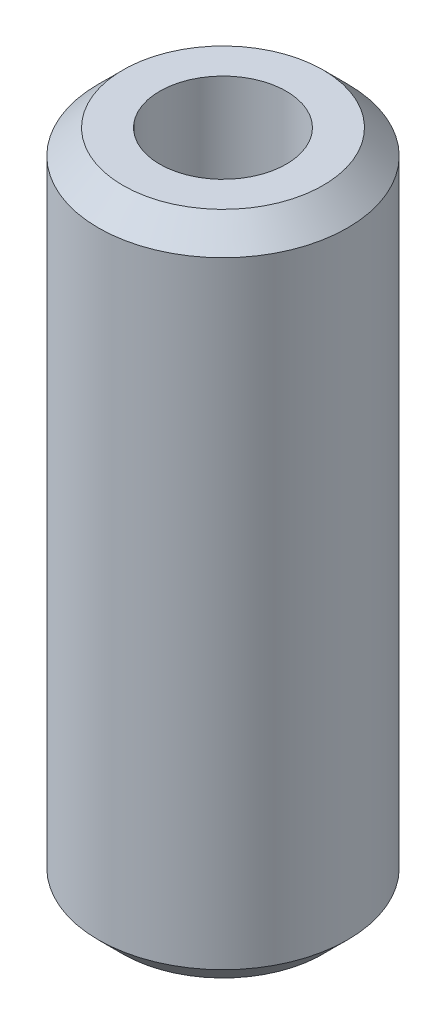
ISO-10303-21;
HEADER;
FILE_DESCRIPTION(('STEP AP214'),'2;1');
FILE_NAME('part.step','',(''),(''),'','','');
FILE_SCHEMA(('AUTOMOTIVE_DESIGN { 1 0 10303 214 1 1 1 1 }'));
ENDSEC;
DATA;
#1=APPLICATION_CONTEXT('core data for automotive mechanical design processes');
#2=APPLICATION_PROTOCOL_DEFINITION('international standard','automotive_design',2000,#1);
#3=PRODUCT_CONTEXT('',#1,'mechanical');
#4=PRODUCT('Part','Part','',(#3));
#5=PRODUCT_RELATED_PRODUCT_CATEGORY('part','',(#4));
#6=PRODUCT_DEFINITION_FORMATION('','',#4);
#7=PRODUCT_DEFINITION_CONTEXT('part definition',#1,'design');
#8=PRODUCT_DEFINITION('design','',#6,#7);
#9=PRODUCT_DEFINITION_SHAPE('','',#8);
#10=(LENGTH_UNIT() NAMED_UNIT(*) SI_UNIT(.MILLI.,.METRE.));
#11=(NAMED_UNIT(*) PLANE_ANGLE_UNIT() SI_UNIT($,.RADIAN.));
#12=(NAMED_UNIT(*) SI_UNIT($,.STERADIAN.) SOLID_ANGLE_UNIT());
#13=UNCERTAINTY_MEASURE_WITH_UNIT(LENGTH_MEASURE(1.E-05),#10,'distance_accuracy_value','');
#14=(GEOMETRIC_REPRESENTATION_CONTEXT(3) GLOBAL_UNCERTAINTY_ASSIGNED_CONTEXT((#13)) GLOBAL_UNIT_ASSIGNED_CONTEXT((#10,
#11,#12)) REPRESENTATION_CONTEXT('',''));
#15=CARTESIAN_POINT('',(0.,0.,0.));
#16=DIRECTION('',(0.,0.,1.));
#17=DIRECTION('',(1.,0.,0.));
#18=AXIS2_PLACEMENT_3D('',#15,#16,#17);
#19=CARTESIAN_POINT('',(0.,67.85,0.));
#20=DIRECTION('',(0.,1.,0.));
#21=DIRECTION('',(0.,0.,1.));
#22=AXIS2_PLACEMENT_3D('',#19,#20,#21);
#23=PLANE('',#22);
#24=CARTESIAN_POINT('',(0.,67.85,0.));
#25=DIRECTION('',(0.,1.,0.));
#26=DIRECTION('',(0.,0.,1.));
#27=AXIS2_PLACEMENT_3D('',#24,#25,#26);
#28=CIRCLE('',#27,10.2);
#29=CARTESIAN_POINT('',(0.,67.85,10.2));
#30=VERTEX_POINT('',#29);
#31=EDGE_CURVE('E10',#30,#30,#28,.T.);
#32=ORIENTED_EDGE('',*,*,#31,.T.);
#33=EDGE_LOOP('',(#32));
#34=FACE_BOUND('',#33,.T.);
#35=CARTESIAN_POINT('',(0.,67.85,0.));
#36=DIRECTION('',(0.,1.,0.));
#37=DIRECTION('',(0.,0.,1.));
#38=AXIS2_PLACEMENT_3D('',#35,#36,#37);
#39=CIRCLE('',#38,6.45);
#40=CARTESIAN_POINT('',(0.,67.85,6.45));
#41=VERTEX_POINT('',#40);
#42=EDGE_CURVE('E70',#41,#41,#39,.T.);
#43=ORIENTED_EDGE('',*,*,#42,.F.);
#44=EDGE_LOOP('',(#43));
#45=FACE_BOUND('',#44,.T.);
#46=ADVANCED_FACE('F45',(#34,#45),#23,.T.);
#47=CARTESIAN_POINT('',(0.,0.,0.));
#48=DIRECTION('',(0.,1.,0.));
#49=DIRECTION('',(0.,0.,1.));
#50=AXIS2_PLACEMENT_3D('',#47,#48,#49);
#51=PLANE('',#50);
#52=CARTESIAN_POINT('',(0.,0.,0.));
#53=DIRECTION('',(0.,1.,0.));
#54=DIRECTION('',(0.,0.,1.));
#55=AXIS2_PLACEMENT_3D('',#52,#53,#54);
#56=CIRCLE('',#55,10.2);
#57=CARTESIAN_POINT('',(0.,0.,10.2));
#58=VERTEX_POINT('',#57);
#59=EDGE_CURVE('E54',#58,#58,#56,.F.);
#60=ORIENTED_EDGE('',*,*,#59,.T.);
#61=EDGE_LOOP('',(#60));
#62=FACE_BOUND('',#61,.T.);
#63=CARTESIAN_POINT('',(0.,0.,0.));
#64=DIRECTION('',(0.,1.,0.));
#65=DIRECTION('',(0.,0.,1.));
#66=AXIS2_PLACEMENT_3D('',#63,#64,#65);
#67=CIRCLE('',#66,6.45);
#68=CARTESIAN_POINT('',(0.,0.,6.45));
#69=VERTEX_POINT('',#68);
#70=EDGE_CURVE('E71',#69,#69,#67,.T.);
#71=ORIENTED_EDGE('',*,*,#70,.T.);
#72=EDGE_LOOP('',(#71));
#73=FACE_BOUND('',#72,.T.);
#74=ADVANCED_FACE('F83',(#62,#73),#51,.F.);
#75=CARTESIAN_POINT('',(0.,67.85,0.));
#76=DIRECTION('',(0.,-1.,0.));
#77=DIRECTION('',(0.,0.,-1.));
#78=AXIS2_PLACEMENT_3D('',#75,#76,#77);
#79=CYLINDRICAL_SURFACE('',#78,12.7);
#80=CARTESIAN_POINT('',(0.,2.49999999999999,0.));
#81=DIRECTION('',(0.,1.,0.));
#82=DIRECTION('',(0.,0.,1.));
#83=AXIS2_PLACEMENT_3D('',#80,#81,#82);
#84=CIRCLE('',#83,12.7);
#85=CARTESIAN_POINT('',(0.,2.49999999999999,12.7));
#86=VERTEX_POINT('',#85);
#87=EDGE_CURVE('E59',#86,#86,#84,.T.);
#88=ORIENTED_EDGE('',*,*,#87,.T.);
#89=EDGE_LOOP('',(#88));
#90=FACE_BOUND('',#89,.T.);
#91=CARTESIAN_POINT('',(0.,65.35,0.));
#92=DIRECTION('',(0.,1.,0.));
#93=DIRECTION('',(0.,0.,1.));
#94=AXIS2_PLACEMENT_3D('',#91,#92,#93);
#95=CIRCLE('',#94,12.7);
#96=CARTESIAN_POINT('',(0.,65.35,12.7));
#97=VERTEX_POINT('',#96);
#98=EDGE_CURVE('E64',#97,#97,#95,.F.);
#99=ORIENTED_EDGE('',*,*,#98,.T.);
#100=EDGE_LOOP('',(#99));
#101=FACE_BOUND('',#100,.T.);
#102=ADVANCED_FACE('F89',(#90,#101),#79,.T.);
#103=CARTESIAN_POINT('',(0.,67.85,0.));
#104=DIRECTION('',(0.,-1.,0.));
#105=DIRECTION('',(0.,0.,-1.));
#106=AXIS2_PLACEMENT_3D('',#103,#104,#105);
#107=CYLINDRICAL_SURFACE('',#106,6.45);
#108=ORIENTED_EDGE('',*,*,#42,.T.);
#109=EDGE_LOOP('',(#108));
#110=FACE_BOUND('',#109,.T.);
#111=ORIENTED_EDGE('',*,*,#70,.F.);
#112=EDGE_LOOP('',(#111));
#113=FACE_BOUND('',#112,.T.);
#114=ADVANCED_FACE('F79',(#110,#113),#107,.F.);
#115=CARTESIAN_POINT('',(0.,2.49999999999999,0.));
#116=DIRECTION('',(0.,1.,0.));
#117=DIRECTION('',(0.,0.,1.));
#118=AXIS2_PLACEMENT_3D('',#115,#116,#117);
#119=CONICAL_SURFACE('',#118,12.7,0.785398163397451);
#120=ORIENTED_EDGE('',*,*,#59,.F.);
#121=EDGE_LOOP('',(#120));
#122=FACE_BOUND('',#121,.T.);
#123=ORIENTED_EDGE('',*,*,#87,.F.);
#124=EDGE_LOOP('',(#123));
#125=FACE_BOUND('',#124,.T.);
#126=ADVANCED_FACE('F96',(#122,#125),#119,.T.);
#127=CARTESIAN_POINT('',(0.,67.85,0.));
#128=DIRECTION('',(0.,-1.,0.));
#129=DIRECTION('',(0.,0.,-1.));
#130=AXIS2_PLACEMENT_3D('',#127,#128,#129);
#131=CONICAL_SURFACE('',#130,10.2,0.785398163397445);
#132=ORIENTED_EDGE('',*,*,#98,.F.);
#133=EDGE_LOOP('',(#132));
#134=FACE_BOUND('',#133,.T.);
#135=ORIENTED_EDGE('',*,*,#31,.F.);
#136=EDGE_LOOP('',(#135));
#137=FACE_BOUND('',#136,.T.);
#138=ADVANCED_FACE('F48',(#134,#137),#131,.T.);
#139=CLOSED_SHELL('',(#46,#74,#102,#114,#126,#138));
#140=MANIFOLD_SOLID_BREP('B2',#139);
#141=ADVANCED_BREP_SHAPE_REPRESENTATION('',(#18,#140),#14);
#142=SHAPE_DEFINITION_REPRESENTATION(#9,#141);
ENDSEC;
END-ISO-10303-21;
